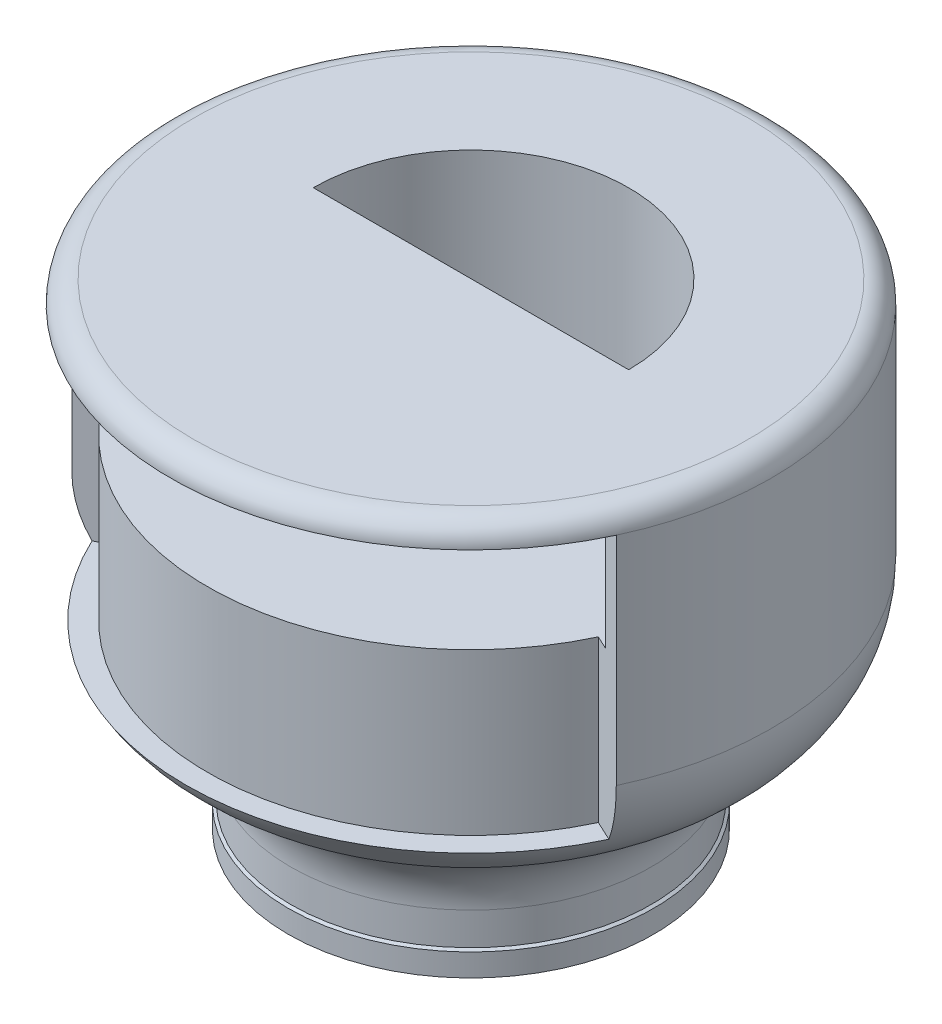
ISO-10303-21;
HEADER;
FILE_DESCRIPTION(('STEP AP214'),'2;1');
FILE_NAME('part.step','',(''),(''),'','','');
FILE_SCHEMA(('AUTOMOTIVE_DESIGN { 1 0 10303 214 1 1 1 1 }'));
ENDSEC;
DATA;
#1=APPLICATION_CONTEXT('core data for automotive mechanical design processes');
#2=APPLICATION_PROTOCOL_DEFINITION('international standard','automotive_design',2000,#1);
#3=PRODUCT_CONTEXT('',#1,'mechanical');
#4=PRODUCT('Part','Part','',(#3));
#5=PRODUCT_RELATED_PRODUCT_CATEGORY('part','',(#4));
#6=PRODUCT_DEFINITION_FORMATION('','',#4);
#7=PRODUCT_DEFINITION_CONTEXT('part definition',#1,'design');
#8=PRODUCT_DEFINITION('design','',#6,#7);
#9=PRODUCT_DEFINITION_SHAPE('','',#8);
#10=(LENGTH_UNIT() NAMED_UNIT(*) SI_UNIT(.MILLI.,.METRE.));
#11=(NAMED_UNIT(*) PLANE_ANGLE_UNIT() SI_UNIT($,.RADIAN.));
#12=(NAMED_UNIT(*) SI_UNIT($,.STERADIAN.) SOLID_ANGLE_UNIT());
#13=UNCERTAINTY_MEASURE_WITH_UNIT(LENGTH_MEASURE(1.E-05),#10,'distance_accuracy_value','');
#14=(GEOMETRIC_REPRESENTATION_CONTEXT(3) GLOBAL_UNCERTAINTY_ASSIGNED_CONTEXT((#13)) GLOBAL_UNIT_ASSIGNED_CONTEXT((#10,
#11,#12)) REPRESENTATION_CONTEXT('',''));
#15=CARTESIAN_POINT('',(0.,0.,0.));
#16=DIRECTION('',(0.,0.,1.));
#17=DIRECTION('',(1.,0.,0.));
#18=AXIS2_PLACEMENT_3D('',#15,#16,#17);
#19=CARTESIAN_POINT('',(0.0221290186607757,62.4278760968653,-0.0548714029169534));
#20=DIRECTION('',(0.,-1.,0.));
#21=DIRECTION('',(0.,0.,-1.));
#22=AXIS2_PLACEMENT_3D('',#19,#20,#21);
#23=CYLINDRICAL_SURFACE('',#22,37.0591655670552);
#24=CARTESIAN_POINT('',(0.0221290186607753,62.4278760968653,-0.0548714029169534));
#25=DIRECTION('',(0.,1.,0.));
#26=DIRECTION('',(0.,0.,-1.));
#27=AXIS2_PLACEMENT_3D('',#24,#25,#26);
#28=CIRCLE('',#27,37.0591655670552);
#29=CARTESIAN_POINT('',(0.0221290186607753,62.4278760968653,-37.1140369699721));
#30=VERTEX_POINT('',#29);
#31=EDGE_CURVE('E204',#30,#30,#28,.T.);
#32=ORIENTED_EDGE('',*,*,#31,.T.);
#33=EDGE_LOOP('',(#32));
#34=FACE_BOUND('',#33,.T.);
#35=CARTESIAN_POINT('',(0.0221290186607753,45.4278760968653,-0.0548714029169534));
#36=DIRECTION('',(0.,1.,0.));
#37=DIRECTION('',(0.,0.,-1.));
#38=AXIS2_PLACEMENT_3D('',#35,#36,#37);
#39=CIRCLE('',#38,37.0591655670552);
#40=CARTESIAN_POINT('',(33.5841273223901,45.4278760968653,15.660535762883));
#41=VERTEX_POINT('',#40);
#42=CARTESIAN_POINT('',(-33.5477967926907,45.4278760968653,15.6435945586593));
#43=VERTEX_POINT('',#42);
#44=EDGE_CURVE('E187',#41,#43,#39,.T.);
#45=ORIENTED_EDGE('',*,*,#44,.F.);
#46=DIRECTION('',(0.,-1.,0.));
#47=VECTOR('',#46,1.);
#48=CARTESIAN_POINT('',(33.5841273223901,62.4278760968653,15.660535762883));
#49=LINE('',#48,#47);
#50=CARTESIAN_POINT('',(33.5841273223901,60.4278760968653,15.660535762883));
#51=VERTEX_POINT('',#50);
#52=EDGE_CURVE('E167',#41,#51,#49,.F.);
#53=ORIENTED_EDGE('',*,*,#52,.T.);
#54=CARTESIAN_POINT('',(0.0221290186607757,60.4278760968653,-0.0548714029169534));
#55=DIRECTION('',(0.,1.,0.));
#56=DIRECTION('',(0.,0.,1.));
#57=AXIS2_PLACEMENT_3D('',#54,#55,#56);
#58=CIRCLE('',#57,37.0591655670552);
#59=CARTESIAN_POINT('',(-33.5477967926907,60.4278760968653,15.6435945586593));
#60=VERTEX_POINT('',#59);
#61=EDGE_CURVE('E50',#60,#51,#58,.T.);
#62=ORIENTED_EDGE('',*,*,#61,.F.);
#63=DIRECTION('',(0.,-1.,0.));
#64=VECTOR('',#63,1.);
#65=CARTESIAN_POINT('',(-33.5477967926907,62.4278760968653,15.6435945586593));
#66=LINE('',#65,#64);
#67=EDGE_CURVE('E142',#43,#60,#66,.F.);
#68=ORIENTED_EDGE('',*,*,#67,.F.);
#69=EDGE_LOOP('',(#45,#53,#62,#68));
#70=FACE_BOUND('',#69,.T.);
#71=ADVANCED_FACE('F41',(#34,#70),#23,.F.);
#72=CARTESIAN_POINT('',(0.0221290186607753,45.4278760968653,-0.0548714029169534));
#73=DIRECTION('',(0.,-1.,0.));
#74=DIRECTION('',(0.,0.,-1.));
#75=AXIS2_PLACEMENT_3D('',#72,#73,#74);
#76=PLANE('',#75);
#77=CARTESIAN_POINT('',(0.0430737136390516,45.4278760968653,-1.99976807517553));
#78=DIRECTION('',(0.,1.,0.));
#79=DIRECTION('',(0.,0.,-1.));
#80=AXIS2_PLACEMENT_3D('',#77,#78,#79);
#81=CIRCLE('',#80,22.3619348601426);
#82=CARTESIAN_POINT('',(22.,45.4278760968653,2.2369191618735));
#83=VERTEX_POINT('',#82);
#84=CARTESIAN_POINT('',(-22.,45.4278760968653,1.76308083812649));
#85=VERTEX_POINT('',#84);
#86=EDGE_CURVE('E179',#83,#85,#81,.T.);
#87=ORIENTED_EDGE('',*,*,#86,.F.);
#88=DIRECTION('',(0.999942018793882,0.,0.0107684284097612));
#89=VECTOR('',#88,1.);
#90=CARTESIAN_POINT('',(-22.,45.4278760968653,1.76308083812649));
#91=LINE('',#90,#89);
#92=EDGE_CURVE('E183',#85,#83,#91,.T.);
#93=ORIENTED_EDGE('',*,*,#92,.F.);
#94=EDGE_LOOP('',(#87,#93));
#95=FACE_BOUND('',#94,.T.);
#96=DIRECTION('',(-0.906307787036651,0.,-0.422618261740697));
#97=VECTOR('',#96,1.);
#98=CARTESIAN_POINT('',(-0.0028403278101153,45.4278760968653,-0.00132446660952737));
#99=LINE('',#98,#97);
#100=CARTESIAN_POINT('',(31.7794250088725,45.4278760968653,14.8189892533996));
#101=VERTEX_POINT('',#100);
#102=EDGE_CURVE('E282',#41,#101,#99,.T.);
#103=ORIENTED_EDGE('',*,*,#102,.F.);
#104=ORIENTED_EDGE('',*,*,#44,.T.);
#105=DIRECTION('',(0.906307787036651,0.,-0.422618261740697));
#106=VECTOR('',#105,1.);
#107=CARTESIAN_POINT('',(0.0391936054805592,45.4278760968653,-0.0182762783862904));
#108=LINE('',#107,#106);
#109=CARTESIAN_POINT('',(-31.7794250088725,45.4278760968653,14.8189892533996));
#110=VERTEX_POINT('',#109);
#111=EDGE_CURVE('E277',#43,#110,#108,.T.);
#112=ORIENTED_EDGE('',*,*,#111,.T.);
#113=CARTESIAN_POINT('',(0.,45.4278760968653,0.));
#114=DIRECTION('',(0.,-1.,0.));
#115=DIRECTION('',(0.,0.,-1.));
#116=AXIS2_PLACEMENT_3D('',#113,#114,#115);
#117=CIRCLE('',#116,35.0647158321143);
#118=EDGE_CURVE('E129',#110,#101,#117,.F.);
#119=ORIENTED_EDGE('',*,*,#118,.T.);
#120=EDGE_LOOP('',(#103,#104,#112,#119));
#121=FACE_BOUND('',#120,.T.);
#122=ADVANCED_FACE('F297',(#95,#121),#76,.F.);
#123=CARTESIAN_POINT('',(0.0221290186607753,62.4278760968653,-0.0548714029169534));
#124=DIRECTION('',(0.,-1.,0.));
#125=DIRECTION('',(0.,0.,-1.));
#126=AXIS2_PLACEMENT_3D('',#123,#124,#125);
#127=PLANE('',#126);
#128=ORIENTED_EDGE('',*,*,#31,.F.);
#129=EDGE_LOOP('',(#128));
#130=FACE_BOUND('',#129,.T.);
#131=CARTESIAN_POINT('',(0.0430737136390516,62.4278760968653,-1.99976807517553));
#132=DIRECTION('',(0.,1.,0.));
#133=DIRECTION('',(0.,0.,-1.));
#134=AXIS2_PLACEMENT_3D('',#131,#132,#133);
#135=CIRCLE('',#134,22.3619348601426);
#136=CARTESIAN_POINT('',(22.,62.4278760968653,2.2369191618735));
#137=VERTEX_POINT('',#136);
#138=CARTESIAN_POINT('',(-22.,62.4278760968653,1.76308083812649));
#139=VERTEX_POINT('',#138);
#140=EDGE_CURVE('E191',#137,#139,#135,.T.);
#141=ORIENTED_EDGE('',*,*,#140,.T.);
#142=DIRECTION('',(0.999942018793882,0.,0.0107684284097612));
#143=VECTOR('',#142,1.);
#144=CARTESIAN_POINT('',(-22.,62.4278760968653,1.76308083812649));
#145=LINE('',#144,#143);
#146=EDGE_CURVE('E195',#139,#137,#145,.T.);
#147=ORIENTED_EDGE('',*,*,#146,.T.);
#148=EDGE_LOOP('',(#141,#147));
#149=FACE_BOUND('',#148,.T.);
#150=ADVANCED_FACE('F330',(#130,#149),#127,.T.);
#151=CARTESIAN_POINT('',(0.0430737136390516,62.4278760968653,-1.99976807517553));
#152=DIRECTION('',(0.,-1.,0.));
#153=DIRECTION('',(0.,0.,-1.));
#154=AXIS2_PLACEMENT_3D('',#151,#152,#153);
#155=CYLINDRICAL_SURFACE('',#154,22.3619348601426);
#156=DIRECTION('',(0.,-1.,0.));
#157=VECTOR('',#156,1.);
#158=CARTESIAN_POINT('',(-22.,62.4278760968653,1.76308083812649));
#159=LINE('',#158,#157);
#160=EDGE_CURVE('E201',#139,#85,#159,.T.);
#161=ORIENTED_EDGE('',*,*,#160,.F.);
#162=ORIENTED_EDGE('',*,*,#140,.F.);
#163=DIRECTION('',(0.,-1.,0.));
#164=VECTOR('',#163,1.);
#165=CARTESIAN_POINT('',(22.,62.4278760968653,2.2369191618735));
#166=LINE('',#165,#164);
#167=EDGE_CURVE('E198',#137,#83,#166,.T.);
#168=ORIENTED_EDGE('',*,*,#167,.T.);
#169=ORIENTED_EDGE('',*,*,#86,.T.);
#170=EDGE_LOOP('',(#161,#162,#168,#169));
#171=FACE_BOUND('',#170,.T.);
#172=ADVANCED_FACE('F383',(#171),#155,.T.);
#173=CARTESIAN_POINT('',(-22.,62.4278760968653,1.76308083812649));
#174=DIRECTION('',(0.0107684284097612,0.,-0.999942018793882));
#175=DIRECTION('',(-0.999942018793882,0.,-0.0107684284097612));
#176=AXIS2_PLACEMENT_3D('',#173,#174,#175);
#177=PLANE('',#176);
#178=ORIENTED_EDGE('',*,*,#167,.F.);
#179=ORIENTED_EDGE('',*,*,#146,.F.);
#180=ORIENTED_EDGE('',*,*,#160,.T.);
#181=ORIENTED_EDGE('',*,*,#92,.T.);
#182=EDGE_LOOP('',(#178,#179,#180,#181));
#183=FACE_BOUND('',#182,.T.);
#184=ADVANCED_FACE('F379',(#183),#177,.F.);
#185=CARTESIAN_POINT('',(0.,0.,0.));
#186=DIRECTION('',(0.,-1.,0.));
#187=DIRECTION('',(0.,0.,-1.));
#188=AXIS2_PLACEMENT_3D('',#185,#186,#187);
#189=CYLINDRICAL_SURFACE('',#188,35.0647158321143);
#190=DIRECTION('',(0.,-1.,0.));
#191=VECTOR('',#190,1.);
#192=CARTESIAN_POINT('',(-31.7794250088725,60.4278760968653,14.8189892533996));
#193=LINE('',#192,#191);
#194=CARTESIAN_POINT('',(-31.7794250088725,24.0163483206538,14.8189892533996));
#195=VERTEX_POINT('',#194);
#196=EDGE_CURVE('E64',#110,#195,#193,.T.);
#197=ORIENTED_EDGE('',*,*,#196,.T.);
#198=CARTESIAN_POINT('',(0.,24.0163483206538,0.));
#199=DIRECTION('',(0.,-1.,0.));
#200=DIRECTION('',(0.,0.,-1.));
#201=AXIS2_PLACEMENT_3D('',#198,#199,#200);
#202=CIRCLE('',#201,35.0647158321143);
#203=CARTESIAN_POINT('',(31.7794250088725,24.0163483206538,14.8189892533996));
#204=VERTEX_POINT('',#203);
#205=EDGE_CURVE('E126',#204,#195,#202,.T.);
#206=ORIENTED_EDGE('',*,*,#205,.F.);
#207=DIRECTION('',(0.,-1.,0.));
#208=VECTOR('',#207,1.);
#209=CARTESIAN_POINT('',(31.7794250088725,60.4278760968653,14.8189892533996));
#210=LINE('',#209,#208);
#211=EDGE_CURVE('E143',#101,#204,#210,.T.);
#212=ORIENTED_EDGE('',*,*,#211,.F.);
#213=ORIENTED_EDGE('',*,*,#118,.F.);
#214=EDGE_LOOP('',(#197,#206,#212,#213));
#215=FACE_BOUND('',#214,.T.);
#216=ADVANCED_FACE('F124',(#215),#189,.T.);
#217=CARTESIAN_POINT('',(31.7794250088725,24.0163483206538,14.8189892533996));
#218=DIRECTION('',(0.,-1.,0.));
#219=DIRECTION('',(0.,0.,-1.));
#220=AXIS2_PLACEMENT_3D('',#217,#218,#219);
#221=PLANE('',#220);
#222=CARTESIAN_POINT('',(0.,24.0163483206538,0.));
#223=DIRECTION('',(0.,-1.,0.));
#224=DIRECTION('',(0.,0.,-1.));
#225=AXIS2_PLACEMENT_3D('',#222,#223,#224);
#226=CIRCLE('',#225,37.9672393002924);
#227=CARTESIAN_POINT('',(-34.410004630139,24.0163483206538,16.0456486761827));
#228=VERTEX_POINT('',#227);
#229=CARTESIAN_POINT('',(34.410004630139,24.0163483206538,16.0456486761827));
#230=VERTEX_POINT('',#229);
#231=EDGE_CURVE('E11',#228,#230,#226,.F.);
#232=ORIENTED_EDGE('',*,*,#231,.T.);
#233=DIRECTION('',(0.906307787036651,0.,0.422618261740697));
#234=VECTOR('',#233,1.);
#235=CARTESIAN_POINT('',(31.7794250088725,24.0163483206538,14.8189892533996));
#236=LINE('',#235,#234);
#237=EDGE_CURVE('E132',#204,#230,#236,.T.);
#238=ORIENTED_EDGE('',*,*,#237,.F.);
#239=ORIENTED_EDGE('',*,*,#205,.T.);
#240=DIRECTION('',(-0.906307787036651,0.,0.422618261740697));
#241=VECTOR('',#240,1.);
#242=CARTESIAN_POINT('',(-31.7794250088725,24.0163483206538,14.8189892533996));
#243=LINE('',#242,#241);
#244=EDGE_CURVE('E138',#195,#228,#243,.T.);
#245=ORIENTED_EDGE('',*,*,#244,.T.);
#246=EDGE_LOOP('',(#232,#238,#239,#245));
#247=FACE_BOUND('',#246,.T.);
#248=ADVANCED_FACE('F137',(#247),#221,.F.);
#249=CARTESIAN_POINT('',(42.6551184533123,60.4278760968653,19.890408394288));
#250=DIRECTION('',(0.,1.,0.));
#251=DIRECTION('',(0.,0.,1.));
#252=AXIS2_PLACEMENT_3D('',#249,#250,#251);
#253=PLANE('',#252);
#254=CARTESIAN_POINT('',(0.,60.4278760968653,0.));
#255=DIRECTION('',(0.,-1.,0.));
#256=DIRECTION('',(0.,0.,-1.));
#257=AXIS2_PLACEMENT_3D('',#254,#255,#256);
#258=CIRCLE('',#257,40.);
#259=CARTESIAN_POINT('',(36.252311481466,60.4278760968653,16.9047304696279));
#260=VERTEX_POINT('',#259);
#261=CARTESIAN_POINT('',(-36.2523114814661,60.4278760968653,16.9047304696279));
#262=VERTEX_POINT('',#261);
#263=EDGE_CURVE('E255',#260,#262,#258,.T.);
#264=ORIENTED_EDGE('',*,*,#263,.T.);
#265=DIRECTION('',(0.906307787036651,0.,-0.422618261740697));
#266=VECTOR('',#265,1.);
#267=CARTESIAN_POINT('',(-42.6551184533123,60.4278760968653,19.890408394288));
#268=LINE('',#267,#266);
#269=EDGE_CURVE('E133',#262,#60,#268,.T.);
#270=ORIENTED_EDGE('',*,*,#269,.T.);
#271=ORIENTED_EDGE('',*,*,#61,.T.);
#272=DIRECTION('',(-0.906307787036651,0.,-0.422618261740697));
#273=VECTOR('',#272,1.);
#274=CARTESIAN_POINT('',(42.6551184533123,60.4278760968653,19.890408394288));
#275=LINE('',#274,#273);
#276=EDGE_CURVE('E155',#260,#51,#275,.T.);
#277=ORIENTED_EDGE('',*,*,#276,.F.);
#278=EDGE_LOOP('',(#264,#270,#271,#277));
#279=FACE_BOUND('',#278,.T.);
#280=ADVANCED_FACE('F288',(#279),#253,.F.);
#281=CARTESIAN_POINT('',(0.,0.,0.));
#282=DIRECTION('',(-0.422618261740697,0.,0.906307787036651));
#283=DIRECTION('',(0.906307787036651,0.,0.422618261740697));
#284=AXIS2_PLACEMENT_3D('',#281,#282,#283);
#285=PLANE('',#284);
#286=ORIENTED_EDGE('',*,*,#276,.T.);
#287=ORIENTED_EDGE('',*,*,#52,.F.);
#288=ORIENTED_EDGE('',*,*,#102,.T.);
#289=ORIENTED_EDGE('',*,*,#211,.T.);
#290=ORIENTED_EDGE('',*,*,#237,.T.);
#291=CARTESIAN_POINT('',(22.6576946759163,31.5562889655761,10.5654565435174));
#292=DIRECTION('',(-0.422618261740697,0.,0.906307787036651));
#293=DIRECTION('',(0.906307787036651,0.,0.422618261740697));
#294=AXIS2_PLACEMENT_3D('',#291,#292,#293);
#295=CIRCLE('',#294,15.);
#296=CARTESIAN_POINT('',(36.252311481466,31.5562889655761,16.9047304696279));
#297=VERTEX_POINT('',#296);
#298=EDGE_CURVE('E171',#297,#230,#295,.F.);
#299=ORIENTED_EDGE('',*,*,#298,.F.);
#300=DIRECTION('',(0.,-1.,0.));
#301=VECTOR('',#300,1.);
#302=CARTESIAN_POINT('',(36.252311481466,0.,16.9047304696279));
#303=LINE('',#302,#301);
#304=EDGE_CURVE('E175',#260,#297,#303,.T.);
#305=ORIENTED_EDGE('',*,*,#304,.F.);
#306=EDGE_LOOP('',(#286,#287,#288,#289,#290,#299,#305));
#307=FACE_BOUND('',#306,.T.);
#308=ADVANCED_FACE('F293',(#307),#285,.T.);
#309=CARTESIAN_POINT('',(0.,0.,0.));
#310=DIRECTION('',(-0.422618261740697,0.,-0.906307787036651));
#311=DIRECTION('',(-0.906307787036651,0.,0.422618261740697));
#312=AXIS2_PLACEMENT_3D('',#309,#310,#311);
#313=PLANE('',#312);
#314=DIRECTION('',(0.,-1.,0.));
#315=VECTOR('',#314,1.);
#316=CARTESIAN_POINT('',(-36.2523114814661,0.,16.9047304696279));
#317=LINE('',#316,#315);
#318=CARTESIAN_POINT('',(-36.252311481466,31.5562889655761,16.9047304696279));
#319=VERTEX_POINT('',#318);
#320=EDGE_CURVE('E57',#262,#319,#317,.T.);
#321=ORIENTED_EDGE('',*,*,#320,.T.);
#322=CARTESIAN_POINT('',(-22.6576946759163,31.5562889655761,10.5654565435174));
#323=DIRECTION('',(-0.422618261740697,0.,-0.906307787036651));
#324=DIRECTION('',(-0.906307787036651,0.,0.422618261740697));
#325=AXIS2_PLACEMENT_3D('',#322,#323,#324);
#326=CIRCLE('',#325,15.);
#327=EDGE_CURVE('E146',#319,#228,#326,.F.);
#328=ORIENTED_EDGE('',*,*,#327,.T.);
#329=ORIENTED_EDGE('',*,*,#244,.F.);
#330=ORIENTED_EDGE('',*,*,#196,.F.);
#331=ORIENTED_EDGE('',*,*,#111,.F.);
#332=ORIENTED_EDGE('',*,*,#67,.T.);
#333=ORIENTED_EDGE('',*,*,#269,.F.);
#334=EDGE_LOOP('',(#321,#328,#329,#330,#331,#332,#333));
#335=FACE_BOUND('',#334,.T.);
#336=ADVANCED_FACE('F145',(#335),#313,.F.);
#337=CARTESIAN_POINT('',(0.,0.,0.));
#338=DIRECTION('',(0.,-1.,0.));
#339=DIRECTION('',(0.,0.,-1.));
#340=AXIS2_PLACEMENT_3D('',#337,#338,#339);
#341=CYLINDRICAL_SURFACE('',#340,40.);
#342=EDGE_CURVE('E254',#262,#260,#258,.T.);
#343=ORIENTED_EDGE('',*,*,#342,.T.);
#344=ORIENTED_EDGE('',*,*,#304,.T.);
#345=CARTESIAN_POINT('',(0.,31.5562889655761,0.));
#346=DIRECTION('',(0.,-1.,0.));
#347=DIRECTION('',(0.,0.,-1.));
#348=AXIS2_PLACEMENT_3D('',#345,#346,#347);
#349=CIRCLE('',#348,40.);
#350=EDGE_CURVE('E250',#319,#297,#349,.T.);
#351=ORIENTED_EDGE('',*,*,#350,.F.);
#352=ORIENTED_EDGE('',*,*,#320,.F.);
#353=EDGE_LOOP('',(#343,#344,#351,#352));
#354=FACE_BOUND('',#353,.T.);
#355=ADVANCED_FACE('F302',(#354),#341,.T.);
#356=CARTESIAN_POINT('',(0.,31.5562889655761,0.));
#357=DIRECTION('',(0.,-1.,0.));
#358=DIRECTION('',(0.,0.,-1.));
#359=AXIS2_PLACEMENT_3D('',#356,#357,#358);
#360=TOROIDAL_SURFACE('',#359,25.,15.);
#361=CARTESIAN_POINT('',(0.,18.9896485668923,0.));
#362=DIRECTION('',(0.,-1.,0.));
#363=DIRECTION('',(0.,0.,-1.));
#364=AXIS2_PLACEMENT_3D('',#361,#362,#363);
#365=CIRCLE('',#364,33.1902105644586);
#366=CARTESIAN_POINT('',(0.,18.9896485668923,-33.1902105644586));
#367=VERTEX_POINT('',#366);
#368=EDGE_CURVE('E246',#367,#367,#365,.T.);
#369=ORIENTED_EDGE('',*,*,#368,.F.);
#370=EDGE_LOOP('',(#369));
#371=FACE_BOUND('',#370,.T.);
#372=ORIENTED_EDGE('',*,*,#350,.T.);
#373=ORIENTED_EDGE('',*,*,#298,.T.);
#374=ORIENTED_EDGE('',*,*,#231,.F.);
#375=ORIENTED_EDGE('',*,*,#327,.F.);
#376=EDGE_LOOP('',(#372,#373,#374,#375));
#377=FACE_BOUND('',#376,.T.);
#378=ADVANCED_FACE('F299',(#371,#377),#360,.T.);
#379=CARTESIAN_POINT('',(0.,0.,0.));
#380=DIRECTION('',(0.,-1.,0.));
#381=DIRECTION('',(0.,0.,-1.));
#382=AXIS2_PLACEMENT_3D('',#379,#380,#381);
#383=CYLINDRICAL_SURFACE('',#382,22.5);
#384=CARTESIAN_POINT('',(0.,0.,0.));
#385=DIRECTION('',(0.,-1.,0.));
#386=DIRECTION('',(0.,0.,-1.));
#387=AXIS2_PLACEMENT_3D('',#384,#385,#386);
#388=CIRCLE('',#387,22.5);
#389=CARTESIAN_POINT('',(0.,0.,-22.5));
#390=VERTEX_POINT('',#389);
#391=EDGE_CURVE('E219',#390,#390,#388,.T.);
#392=ORIENTED_EDGE('',*,*,#391,.T.);
#393=EDGE_LOOP('',(#392));
#394=FACE_BOUND('',#393,.T.);
#395=CARTESIAN_POINT('',(0.,12.5,0.));
#396=DIRECTION('',(0.,-1.,0.));
#397=DIRECTION('',(0.,0.,-1.));
#398=AXIS2_PLACEMENT_3D('',#395,#396,#397);
#399=CIRCLE('',#398,22.5);
#400=CARTESIAN_POINT('',(0.,12.5,-22.5));
#401=VERTEX_POINT('',#400);
#402=EDGE_CURVE('E266',#401,#401,#399,.T.);
#403=ORIENTED_EDGE('',*,*,#402,.F.);
#404=EDGE_LOOP('',(#403));
#405=FACE_BOUND('',#404,.T.);
#406=ADVANCED_FACE('F43',(#394,#405),#383,.F.);
#407=CARTESIAN_POINT('',(0.,12.5,0.));
#408=DIRECTION('',(0.,-1.,0.));
#409=DIRECTION('',(0.,0.,-1.));
#410=AXIS2_PLACEMENT_3D('',#407,#408,#409);
#411=TOROIDAL_SURFACE('',#410,22.,0.5);
#412=ORIENTED_EDGE('',*,*,#402,.T.);
#413=EDGE_LOOP('',(#412));
#414=FACE_BOUND('',#413,.T.);
#415=CARTESIAN_POINT('',(0.,13.,0.));
#416=DIRECTION('',(0.,-1.,0.));
#417=DIRECTION('',(0.,0.,-1.));
#418=AXIS2_PLACEMENT_3D('',#415,#416,#417);
#419=CIRCLE('',#418,22.);
#420=CARTESIAN_POINT('',(0.,13.,-22.));
#421=VERTEX_POINT('',#420);
#422=EDGE_CURVE('E262',#421,#421,#419,.T.);
#423=ORIENTED_EDGE('',*,*,#422,.F.);
#424=EDGE_LOOP('',(#423));
#425=FACE_BOUND('',#424,.T.);
#426=ADVANCED_FACE('F525',(#414,#425),#411,.F.);
#427=CARTESIAN_POINT('',(0.,13.,0.));
#428=DIRECTION('',(0.,-1.,0.));
#429=DIRECTION('',(0.,0.,-1.));
#430=AXIS2_PLACEMENT_3D('',#427,#428,#429);
#431=PLANE('',#430);
#432=CARTESIAN_POINT('',(0.,13.,0.));
#433=DIRECTION('',(0.,-1.,0.));
#434=DIRECTION('',(0.,0.,1.));
#435=AXIS2_PLACEMENT_3D('',#432,#433,#434);
#436=CIRCLE('',#435,21.);
#437=CARTESIAN_POINT('',(-21.,13.,0.));
#438=VERTEX_POINT('',#437);
#439=CARTESIAN_POINT('',(21.,13.,0.));
#440=VERTEX_POINT('',#439);
#441=EDGE_CURVE('E208',#438,#440,#436,.T.);
#442=ORIENTED_EDGE('',*,*,#441,.F.);
#443=DIRECTION('',(-1.,0.,0.));
#444=VECTOR('',#443,1.);
#445=CARTESIAN_POINT('',(21.,13.,0.));
#446=LINE('',#445,#444);
#447=EDGE_CURVE('E211',#440,#438,#446,.T.);
#448=ORIENTED_EDGE('',*,*,#447,.F.);
#449=EDGE_LOOP('',(#442,#448));
#450=FACE_BOUND('',#449,.T.);
#451=ORIENTED_EDGE('',*,*,#422,.T.);
#452=EDGE_LOOP('',(#451));
#453=FACE_BOUND('',#452,.T.);
#454=ADVANCED_FACE('F320',(#450,#453),#431,.T.);
#455=CARTESIAN_POINT('',(0.,63.4278760968653,0.));
#456=DIRECTION('',(0.,1.,0.));
#457=DIRECTION('',(0.,0.,1.));
#458=AXIS2_PLACEMENT_3D('',#455,#456,#457);
#459=PLANE('',#458);
#460=CARTESIAN_POINT('',(0.,63.4278760968653,0.));
#461=DIRECTION('',(0.,1.,0.));
#462=DIRECTION('',(0.,0.,1.));
#463=AXIS2_PLACEMENT_3D('',#460,#461,#462);
#464=CIRCLE('',#463,21.);
#465=CARTESIAN_POINT('',(21.,63.4278760968653,0.));
#466=VERTEX_POINT('',#465);
#467=CARTESIAN_POINT('',(-21.,63.4278760968653,0.));
#468=VERTEX_POINT('',#467);
#469=EDGE_CURVE('E273',#466,#468,#464,.T.);
#470=ORIENTED_EDGE('',*,*,#469,.F.);
#471=DIRECTION('',(1.,0.,0.));
#472=VECTOR('',#471,1.);
#473=CARTESIAN_POINT('',(0.,63.4278760968653,0.));
#474=LINE('',#473,#472);
#475=EDGE_CURVE('E270',#468,#466,#474,.T.);
#476=ORIENTED_EDGE('',*,*,#475,.F.);
#477=EDGE_LOOP('',(#470,#476));
#478=FACE_BOUND('',#477,.T.);
#479=CARTESIAN_POINT('',(0.,63.4278760968653,0.));
#480=DIRECTION('',(0.,-1.,0.));
#481=DIRECTION('',(0.,0.,-1.));
#482=AXIS2_PLACEMENT_3D('',#479,#480,#481);
#483=CIRCLE('',#482,37.);
#484=CARTESIAN_POINT('',(0.,63.4278760968653,-37.));
#485=VERTEX_POINT('',#484);
#486=EDGE_CURVE('E258',#485,#485,#483,.T.);
#487=ORIENTED_EDGE('',*,*,#486,.F.);
#488=EDGE_LOOP('',(#487));
#489=FACE_BOUND('',#488,.T.);
#490=ADVANCED_FACE('F310',(#478,#489),#459,.T.);
#491=CARTESIAN_POINT('',(0.,60.4278760968653,0.));
#492=DIRECTION('',(0.,-1.,0.));
#493=DIRECTION('',(0.,0.,-1.));
#494=AXIS2_PLACEMENT_3D('',#491,#492,#493);
#495=TOROIDAL_SURFACE('',#494,37.,3.);
#496=ORIENTED_EDGE('',*,*,#486,.T.);
#497=EDGE_LOOP('',(#496));
#498=FACE_BOUND('',#497,.T.);
#499=ORIENTED_EDGE('',*,*,#263,.F.);
#500=ORIENTED_EDGE('',*,*,#342,.F.);
#501=EDGE_LOOP('',(#499,#500));
#502=FACE_BOUND('',#501,.T.);
#503=ADVANCED_FACE('F307',(#498,#502),#495,.T.);
#504=CARTESIAN_POINT('',(0.,15.9588183533154,0.));
#505=DIRECTION('',(0.,1.,0.));
#506=DIRECTION('',(0.,0.,1.));
#507=AXIS2_PLACEMENT_3D('',#504,#505,#506);
#508=CONICAL_SURFACE('',#507,28.5398596236943,0.993197296529964);
#509=ORIENTED_EDGE('',*,*,#368,.T.);
#510=EDGE_LOOP('',(#509));
#511=FACE_BOUND('',#510,.T.);
#512=CARTESIAN_POINT('',(0.,15.9588183533154,0.));
#513=DIRECTION('',(0.,-1.,0.));
#514=DIRECTION('',(0.,0.,-1.));
#515=AXIS2_PLACEMENT_3D('',#512,#513,#514);
#516=CIRCLE('',#515,28.5398596236943);
#517=CARTESIAN_POINT('',(0.,15.9588183533154,-28.5398596236943));
#518=VERTEX_POINT('',#517);
#519=EDGE_CURVE('E242',#518,#518,#516,.T.);
#520=ORIENTED_EDGE('',*,*,#519,.F.);
#521=EDGE_LOOP('',(#520));
#522=FACE_BOUND('',#521,.T.);
#523=ADVANCED_FACE('F309',(#511,#522),#508,.T.);
#524=CARTESIAN_POINT('',(0.,7.58105808752617,0.));
#525=DIRECTION('',(0.,-1.,0.));
#526=DIRECTION('',(0.,0.,-1.));
#527=AXIS2_PLACEMENT_3D('',#524,#525,#526);
#528=TOROIDAL_SURFACE('',#527,34.,10.);
#529=ORIENTED_EDGE('',*,*,#519,.T.);
#530=EDGE_LOOP('',(#529));
#531=FACE_BOUND('',#530,.T.);
#532=CARTESIAN_POINT('',(0.,7.58105808752612,0.));
#533=DIRECTION('',(0.,-1.,0.));
#534=DIRECTION('',(0.,0.,-1.));
#535=AXIS2_PLACEMENT_3D('',#532,#533,#534);
#536=CIRCLE('',#535,24.);
#537=CARTESIAN_POINT('',(0.,7.58105808752612,-24.));
#538=VERTEX_POINT('',#537);
#539=EDGE_CURVE('E238',#538,#538,#536,.T.);
#540=ORIENTED_EDGE('',*,*,#539,.F.);
#541=EDGE_LOOP('',(#540));
#542=FACE_BOUND('',#541,.T.);
#543=ADVANCED_FACE('F317',(#531,#542),#528,.F.);
#544=CARTESIAN_POINT('',(0.,0.,0.));
#545=DIRECTION('',(0.,-1.,0.));
#546=DIRECTION('',(0.,0.,-1.));
#547=AXIS2_PLACEMENT_3D('',#544,#545,#546);
#548=CYLINDRICAL_SURFACE('',#547,24.);
#549=ORIENTED_EDGE('',*,*,#539,.T.);
#550=EDGE_LOOP('',(#549));
#551=FACE_BOUND('',#550,.T.);
#552=CARTESIAN_POINT('',(0.,3.25,0.));
#553=DIRECTION('',(0.,-1.,0.));
#554=DIRECTION('',(0.,0.,-1.));
#555=AXIS2_PLACEMENT_3D('',#552,#553,#554);
#556=CIRCLE('',#555,24.);
#557=CARTESIAN_POINT('',(0.,3.25,-24.));
#558=VERTEX_POINT('',#557);
#559=EDGE_CURVE('E234',#558,#558,#556,.T.);
#560=ORIENTED_EDGE('',*,*,#559,.F.);
#561=EDGE_LOOP('',(#560));
#562=FACE_BOUND('',#561,.T.);
#563=ADVANCED_FACE('F355',(#551,#562),#548,.T.);
#564=CARTESIAN_POINT('',(0.,3.,0.));
#565=DIRECTION('',(0.,-1.,0.));
#566=DIRECTION('',(0.,0.,-1.));
#567=AXIS2_PLACEMENT_3D('',#564,#565,#566);
#568=CONICAL_SURFACE('',#567,24.35,0.950546840812071);
#569=ORIENTED_EDGE('',*,*,#559,.T.);
#570=EDGE_LOOP('',(#569));
#571=FACE_BOUND('',#570,.T.);
#572=CARTESIAN_POINT('',(0.,3.,0.));
#573=DIRECTION('',(0.,-1.,0.));
#574=DIRECTION('',(0.,0.,-1.));
#575=AXIS2_PLACEMENT_3D('',#572,#573,#574);
#576=CIRCLE('',#575,24.35);
#577=CARTESIAN_POINT('',(0.,3.,-24.35));
#578=VERTEX_POINT('',#577);
#579=EDGE_CURVE('E230',#578,#578,#576,.T.);
#580=ORIENTED_EDGE('',*,*,#579,.F.);
#581=EDGE_LOOP('',(#580));
#582=FACE_BOUND('',#581,.T.);
#583=ADVANCED_FACE('F351',(#571,#582),#568,.T.);
#584=CARTESIAN_POINT('',(0.,0.,0.));
#585=DIRECTION('',(0.,-1.,0.));
#586=DIRECTION('',(0.,0.,-1.));
#587=AXIS2_PLACEMENT_3D('',#584,#585,#586);
#588=CYLINDRICAL_SURFACE('',#587,24.35);
#589=ORIENTED_EDGE('',*,*,#579,.T.);
#590=EDGE_LOOP('',(#589));
#591=FACE_BOUND('',#590,.T.);
#592=CARTESIAN_POINT('',(0.,0.,0.));
#593=DIRECTION('',(0.,-1.,0.));
#594=DIRECTION('',(0.,0.,-1.));
#595=AXIS2_PLACEMENT_3D('',#592,#593,#594);
#596=CIRCLE('',#595,24.35);
#597=CARTESIAN_POINT('',(0.,0.,-24.35));
#598=VERTEX_POINT('',#597);
#599=EDGE_CURVE('E226',#598,#598,#596,.T.);
#600=ORIENTED_EDGE('',*,*,#599,.F.);
#601=EDGE_LOOP('',(#600));
#602=FACE_BOUND('',#601,.T.);
#603=ADVANCED_FACE('F347',(#591,#602),#588,.T.);
#604=CARTESIAN_POINT('',(22.5,0.,0.));
#605=DIRECTION('',(0.,-1.,0.));
#606=DIRECTION('',(0.,0.,-1.));
#607=AXIS2_PLACEMENT_3D('',#604,#605,#606);
#608=PLANE('',#607);
#609=ORIENTED_EDGE('',*,*,#599,.T.);
#610=EDGE_LOOP('',(#609));
#611=FACE_BOUND('',#610,.T.);
#612=ORIENTED_EDGE('',*,*,#391,.F.);
#613=EDGE_LOOP('',(#612));
#614=FACE_BOUND('',#613,.T.);
#615=ADVANCED_FACE('F343',(#611,#614),#608,.T.);
#616=CARTESIAN_POINT('',(0.,73.,0.));
#617=DIRECTION('',(0.,-1.,0.));
#618=DIRECTION('',(0.,0.,-1.));
#619=AXIS2_PLACEMENT_3D('',#616,#617,#618);
#620=CYLINDRICAL_SURFACE('',#619,21.);
#621=ORIENTED_EDGE('',*,*,#469,.T.);
#622=DIRECTION('',(0.,-1.,0.));
#623=VECTOR('',#622,1.);
#624=CARTESIAN_POINT('',(-21.,73.,0.));
#625=LINE('',#624,#623);
#626=EDGE_CURVE('E216',#468,#438,#625,.T.);
#627=ORIENTED_EDGE('',*,*,#626,.T.);
#628=ORIENTED_EDGE('',*,*,#441,.T.);
#629=DIRECTION('',(0.,-1.,0.));
#630=VECTOR('',#629,1.);
#631=CARTESIAN_POINT('',(21.,73.,0.));
#632=LINE('',#631,#630);
#633=EDGE_CURVE('E215',#466,#440,#632,.T.);
#634=ORIENTED_EDGE('',*,*,#633,.F.);
#635=EDGE_LOOP('',(#621,#627,#628,#634));
#636=FACE_BOUND('',#635,.T.);
#637=ADVANCED_FACE('F339',(#636),#620,.F.);
#638=CARTESIAN_POINT('',(21.,73.,0.));
#639=DIRECTION('',(0.,0.,1.));
#640=DIRECTION('',(1.,0.,0.));
#641=AXIS2_PLACEMENT_3D('',#638,#639,#640);
#642=PLANE('',#641);
#643=ORIENTED_EDGE('',*,*,#475,.T.);
#644=ORIENTED_EDGE('',*,*,#633,.T.);
#645=ORIENTED_EDGE('',*,*,#447,.T.);
#646=ORIENTED_EDGE('',*,*,#626,.F.);
#647=EDGE_LOOP('',(#643,#644,#645,#646));
#648=FACE_BOUND('',#647,.T.);
#649=ADVANCED_FACE('F336',(#648),#642,.F.);
#650=CLOSED_SHELL('',(#71,#122,#150,#172,#184,#216,#248,#280,#308,#336,#355,#378,#406,#426,#454,
#490,#503,#523,#543,#563,#583,#603,#615,#637,#649));
#651=MANIFOLD_SOLID_BREP('B2',#650);
#652=ADVANCED_BREP_SHAPE_REPRESENTATION('',(#18,#651),#14);
#653=SHAPE_DEFINITION_REPRESENTATION(#9,#652);
ENDSEC;
END-ISO-10303-21;
